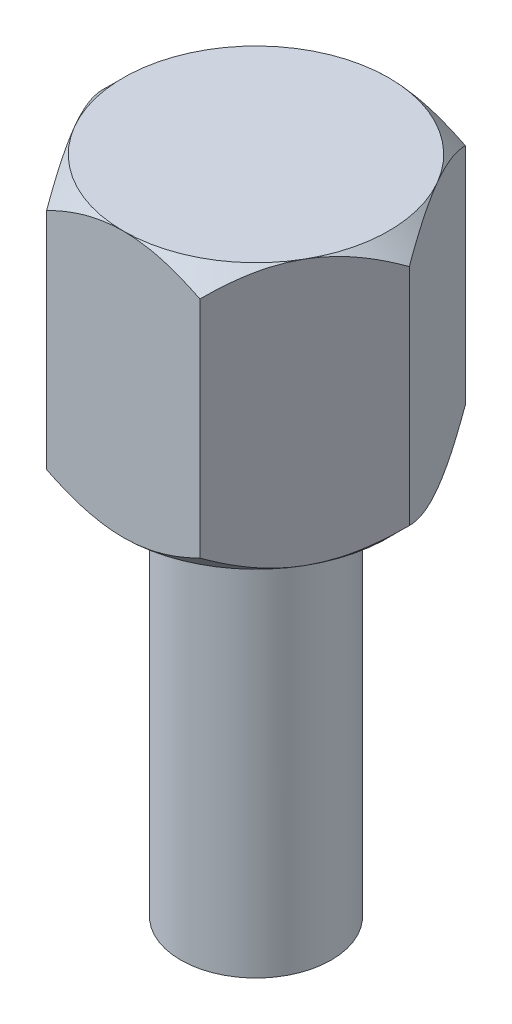
ISO-10303-21;
HEADER;
FILE_DESCRIPTION(('STEP AP214'),'2;1');
FILE_NAME('part.step','',(''),(''),'','','');
FILE_SCHEMA(('AUTOMOTIVE_DESIGN { 1 0 10303 214 1 1 1 1 }'));
ENDSEC;
DATA;
#1=APPLICATION_CONTEXT('core data for automotive mechanical design processes');
#2=APPLICATION_PROTOCOL_DEFINITION('international standard','automotive_design',2000,#1);
#3=PRODUCT_CONTEXT('',#1,'mechanical');
#4=PRODUCT('Part','Part','',(#3));
#5=PRODUCT_RELATED_PRODUCT_CATEGORY('part','',(#4));
#6=PRODUCT_DEFINITION_FORMATION('','',#4);
#7=PRODUCT_DEFINITION_CONTEXT('part definition',#1,'design');
#8=PRODUCT_DEFINITION('design','',#6,#7);
#9=PRODUCT_DEFINITION_SHAPE('','',#8);
#10=(LENGTH_UNIT() NAMED_UNIT(*) SI_UNIT(.MILLI.,.METRE.));
#11=(NAMED_UNIT(*) PLANE_ANGLE_UNIT() SI_UNIT($,.RADIAN.));
#12=(NAMED_UNIT(*) SI_UNIT($,.STERADIAN.) SOLID_ANGLE_UNIT());
#13=UNCERTAINTY_MEASURE_WITH_UNIT(LENGTH_MEASURE(1.E-05),#10,'distance_accuracy_value','');
#14=(GEOMETRIC_REPRESENTATION_CONTEXT(3) GLOBAL_UNCERTAINTY_ASSIGNED_CONTEXT((#13)) GLOBAL_UNIT_ASSIGNED_CONTEXT((#10,
#11,#12)) REPRESENTATION_CONTEXT('',''));
#15=CARTESIAN_POINT('',(0.,0.,0.));
#16=DIRECTION('',(0.,0.,1.));
#17=DIRECTION('',(1.,0.,0.));
#18=AXIS2_PLACEMENT_3D('',#15,#16,#17);
#19=CARTESIAN_POINT('',(0.,0.,0.));
#20=DIRECTION('',(0.,1.,0.));
#21=DIRECTION('',(0.,0.,1.));
#22=AXIS2_PLACEMENT_3D('',#19,#20,#21);
#23=PLANE('',#22);
#24=CARTESIAN_POINT('',(0.,0.,0.));
#25=DIRECTION('',(0.,-1.,0.));
#26=DIRECTION('',(0.,0.,-1.));
#27=AXIS2_PLACEMENT_3D('',#24,#25,#26);
#28=CIRCLE('',#27,2.3495);
#29=CARTESIAN_POINT('',(2.03472668619155,0.,1.17474999999999));
#30=VERTEX_POINT('',#29);
#31=CARTESIAN_POINT('',(0.,0.,2.3495));
#32=VERTEX_POINT('',#31);
#33=EDGE_CURVE('E54',#30,#32,#28,.T.);
#34=ORIENTED_EDGE('',*,*,#33,.T.);
#35=CARTESIAN_POINT('',(-2.03472668619153,0.,1.17475000000002));
#36=VERTEX_POINT('',#35);
#37=EDGE_CURVE('E162',#32,#36,#28,.T.);
#38=ORIENTED_EDGE('',*,*,#37,.T.);
#39=CARTESIAN_POINT('',(-2.03472668619155,0.,-1.17474999999999));
#40=VERTEX_POINT('',#39);
#41=EDGE_CURVE('E161',#36,#40,#28,.T.);
#42=ORIENTED_EDGE('',*,*,#41,.T.);
#43=CARTESIAN_POINT('',(0.,0.,-2.3495));
#44=VERTEX_POINT('',#43);
#45=EDGE_CURVE('E141',#40,#44,#28,.T.);
#46=ORIENTED_EDGE('',*,*,#45,.T.);
#47=CARTESIAN_POINT('',(2.03472668619154,0.,-1.17475));
#48=VERTEX_POINT('',#47);
#49=EDGE_CURVE('E127',#44,#48,#28,.T.);
#50=ORIENTED_EDGE('',*,*,#49,.T.);
#51=EDGE_CURVE('E139',#48,#30,#28,.T.);
#52=ORIENTED_EDGE('',*,*,#51,.T.);
#53=EDGE_LOOP('',(#34,#38,#42,#46,#50,#52));
#54=FACE_BOUND('',#53,.T.);
#55=CARTESIAN_POINT('',(0.,0.,0.));
#56=DIRECTION('',(0.,1.,0.));
#57=DIRECTION('',(0.,0.,1.));
#58=AXIS2_PLACEMENT_3D('',#55,#56,#57);
#59=CIRCLE('',#58,1.3335);
#60=CARTESIAN_POINT('',(0.,0.,1.3335));
#61=VERTEX_POINT('',#60);
#62=EDGE_CURVE('E260',#61,#61,#59,.F.);
#63=ORIENTED_EDGE('',*,*,#62,.F.);
#64=EDGE_LOOP('',(#63));
#65=FACE_BOUND('',#64,.T.);
#66=ADVANCED_FACE('F32',(#54,#65),#23,.F.);
#67=CARTESIAN_POINT('',(0.,-6.985,0.));
#68=DIRECTION('',(0.,1.,0.));
#69=DIRECTION('',(0.,0.,1.));
#70=AXIS2_PLACEMENT_3D('',#67,#68,#69);
#71=CYLINDRICAL_SURFACE('',#70,1.3335);
#72=CARTESIAN_POINT('',(0.,-6.985,0.));
#73=DIRECTION('',(0.,-1.,0.));
#74=DIRECTION('',(0.,0.,-1.));
#75=AXIS2_PLACEMENT_3D('',#72,#73,#74);
#76=CIRCLE('',#75,1.3335);
#77=CARTESIAN_POINT('',(0.,-6.985,-1.3335));
#78=VERTEX_POINT('',#77);
#79=EDGE_CURVE('E243',#78,#78,#76,.T.);
#80=ORIENTED_EDGE('',*,*,#79,.F.);
#81=EDGE_LOOP('',(#80));
#82=FACE_BOUND('',#81,.T.);
#83=ORIENTED_EDGE('',*,*,#62,.T.);
#84=EDGE_LOOP('',(#83));
#85=FACE_BOUND('',#84,.T.);
#86=ADVANCED_FACE('F329',(#82,#85),#71,.T.);
#87=CARTESIAN_POINT('',(0.,-6.985,0.));
#88=DIRECTION('',(0.,-1.,0.));
#89=DIRECTION('',(0.,0.,-1.));
#90=AXIS2_PLACEMENT_3D('',#87,#88,#89);
#91=PLANE('',#90);
#92=ORIENTED_EDGE('',*,*,#79,.T.);
#93=EDGE_LOOP('',(#92));
#94=FACE_BOUND('',#93,.T.);
#95=ADVANCED_FACE('F185',(#94),#91,.T.);
#96=CARTESIAN_POINT('',(0.,0.,0.));
#97=DIRECTION('',(0.,1.,0.));
#98=DIRECTION('',(0.,0.,-1.));
#99=AXIS2_PLACEMENT_3D('',#96,#97,#98);
#100=CONICAL_SURFACE('',#99,2.3495,0.785398163397454);
#101=CARTESIAN_POINT('',(-3.04117298107602,1.49353049048883,2.34950000000003));
#102=CARTESIAN_POINT('',(-2.96843710979389,1.43598372113909,2.34950000000003));
#103=CARTESIAN_POINT('',(-2.89533419226728,1.37889400059673,2.34950000000003));
#104=CARTESIAN_POINT('',(-2.74823611024862,1.26584392661056,2.34950000000003));
#105=CARTESIAN_POINT('',(-2.67424075723903,1.20988381870496,2.34950000000003));
#106=CARTESIAN_POINT('',(-2.5246639049502,1.09891259809597,2.34950000000003));
#107=CARTESIAN_POINT('',(-2.44907462077694,1.04391194624097,2.34950000000003));
#108=CARTESIAN_POINT('',(-2.29668393185426,0.935622716341921,2.34950000000002));
#109=CARTESIAN_POINT('',(-2.21988260853939,0.882334023998813,2.34950000000002));
#110=CARTESIAN_POINT('',(-2.05908468499275,0.773990004885351,2.34950000000002));
#111=CARTESIAN_POINT('',(-1.97497761402756,0.719097826399328,2.34950000000002));
#112=CARTESIAN_POINT('',(-1.80480721375091,0.612438994092082,2.34950000000002));
#113=CARTESIAN_POINT('',(-1.71874413441985,0.560671943932915,2.34950000000002));
#114=CARTESIAN_POINT('',(-1.54454932437983,0.46131443660129,2.34950000000002));
#115=CARTESIAN_POINT('',(-1.45642423725108,0.413712422552854,2.34950000000002));
#116=CARTESIAN_POINT('',(-1.27755397629254,0.323760502877434,2.34950000000001));
#117=CARTESIAN_POINT('',(-1.1868101412994,0.281407970103146,2.34950000000001));
#118=CARTESIAN_POINT('',(-1.01388974361576,0.208384854224984,2.34950000000001));
#119=CARTESIAN_POINT('',(-0.932053567282098,0.176916306059662,2.34950000000001));
#120=CARTESIAN_POINT('',(-0.766115107211668,0.12052020811029,2.34950000000001));
#121=CARTESIAN_POINT('',(-0.682012692918024,0.0955930360639293,2.34950000000001));
#122=CARTESIAN_POINT('',(-0.513626482235181,0.0541336604057618,2.34950000000001));
#123=CARTESIAN_POINT('',(-0.429384640542059,0.0374340801856685,2.3495));
#124=CARTESIAN_POINT('',(-0.259620658355294,0.0128110487239374,2.3495));
#125=CARTESIAN_POINT('',(-0.174098881033762,0.00488515413084087,2.3495));
#126=CARTESIAN_POINT('',(-0.00767828176418667,-0.0013731113032627,2.3495));
#127=CARTESIAN_POINT('',(0.0732005688500038,-0.000235910148391378,2.3495));
#128=CARTESIAN_POINT('',(0.234414464692311,0.0102939909473859,2.3495));
#129=CARTESIAN_POINT('',(0.314749466706155,0.0196873393407567,2.3495));
#130=CARTESIAN_POINT('',(0.47567005422075,0.0463269751997516,2.3495));
#131=CARTESIAN_POINT('',(0.556230839566116,0.0637205675106702,2.34949999999999));
#132=CARTESIAN_POINT('',(0.715528357239278,0.105335764403975,2.34949999999999));
#133=CARTESIAN_POINT('',(0.794265105157154,0.129557310604406,2.34949999999999));
#134=CARTESIAN_POINT('',(1.02917025065882,0.211275161319884,2.34949999999999));
#135=CARTESIAN_POINT('',(1.1823099340665,0.277493904848677,2.34949999999999));
#136=CARTESIAN_POINT('',(1.40646604553115,0.388031047774686,2.34949999999999));
#137=CARTESIAN_POINT('',(1.48039322912378,0.426828693011977,2.34949999999998));
#138=CARTESIAN_POINT('',(1.626579893997,0.507454806764778,2.34949999999998));
#139=CARTESIAN_POINT('',(1.69883965788431,0.549282756632444,2.34949999999998));
#140=CARTESIAN_POINT('',(1.83835620865343,0.633243189062903,2.34949999999998));
#141=CARTESIAN_POINT('',(1.90568400953498,0.675258982949647,2.34949999999998));
#142=CARTESIAN_POINT('',(2.03918405344241,0.761096347744087,2.34949999999998));
#143=CARTESIAN_POINT('',(2.10535621068251,0.804918051903759,2.34949999999998));
#144=CARTESIAN_POINT('',(2.23616822404651,0.893693638345672,2.34949999999998));
#145=CARTESIAN_POINT('',(2.30081606602508,0.938635802090038,2.34949999999998));
#146=CARTESIAN_POINT('',(2.42922252273128,1.02973744650038,2.34949999999998));
#147=CARTESIAN_POINT('',(2.49298137746709,1.07589658848211,2.34949999999997));
#148=CARTESIAN_POINT('',(2.55636695352802,1.12255447121584,2.34949999999997));
#149=B_SPLINE_CURVE_WITH_KNOTS('',3,(#101,#102,#103,#104,#105,#106,#107,#108,#109,#110,#111,
#112,#113,#114,#115,#116,#117,#118,#119,#120,#121,#122,#123,#124,#125,#126,#127,#128,#129,#130,
#131,#132,#133,#134,#135,#136,#137,#138,#139,#140,#141,#142,#143,#144,#145,#146,#147,#148),
.UNSPECIFIED.,.F.,.F.,(4,2,2,2,2,2,2,2,2,2,2,2,2,2,2,2,2,2,2,2,2,2,2,4),(0.,0.278247619308572,
0.55655508242495,0.836980191385023,1.11738653867579,1.41863753594848,1.71985024707439,
2.02019875302913,2.3203963348622,2.58320948376815,2.84603780571955,3.10327243639987,
3.36043541271735,3.60266318005777,3.84490997409741,4.09180762137511,4.33870315763532,
4.83770277404499,5.08814834599015,5.33855115405762,5.57660837997719,5.81468320289126,
6.05087209395873,6.28699593356355),.UNSPECIFIED.);
#150=CARTESIAN_POINT('',(1.35648445746105,0.36346891492205,2.34949999999999));
#151=VERTEX_POINT('',#150);
#152=EDGE_CURVE('E37',#32,#151,#149,.T.);
#153=ORIENTED_EDGE('',*,*,#152,.F.);
#154=ORIENTED_EDGE('',*,*,#33,.F.);
#155=CARTESIAN_POINT('',(1.35636898740722,0.363584392347572,2.34969999999999));
#156=CARTESIAN_POINT('',(1.40299898177264,0.316993248061652,2.26893448060242));
#157=CARTESIAN_POINT('',(1.45040870099858,0.273138389016638,2.18681843813052));
#158=CARTESIAN_POINT('',(1.54708239197061,0.19284104401896,2.01937469361175));
#159=CARTESIAN_POINT('',(1.59635555848423,0.156443237696364,1.93403106576035));
#160=CARTESIAN_POINT('',(1.6957125570454,0.0940930061436109,1.76193969616486));
#161=CARTESIAN_POINT('',(1.74577108317618,0.0679838590291379,1.67523578555434));
#162=CARTESIAN_POINT('',(1.84699020786412,0.0277572287308896,1.49991911889716));
#163=CARTESIAN_POINT('',(1.89814771396378,0.0136097156235198,1.41131171914404));
#164=CARTESIAN_POINT('',(1.98631428878822,0.000845044839261724,1.25860273201879));
#165=CARTESIAN_POINT('',(2.02320944335857,-0.00104461687236826,1.19469844974982));
#166=CARTESIAN_POINT('',(2.09693944919655,0.0021383549727543,1.06699433359609));
#167=CARTESIAN_POINT('',(2.13377427479078,0.00721342941053063,1.00319454417896));
#168=CARTESIAN_POINT('',(2.20709612615048,0.0240370707526633,0.876197372318939));
#169=CARTESIAN_POINT('',(2.24358271631778,0.035793103384641,0.813000744354225));
#170=CARTESIAN_POINT('',(2.31592495761877,0.0653333402077151,0.687700306887508));
#171=CARTESIAN_POINT('',(2.35178065689779,0.0831170822874305,0.625596413995325));
#172=CARTESIAN_POINT('',(2.44362384015089,0.135912845977569,0.466519354272096));
#173=CARTESIAN_POINT('',(2.49904181886124,0.174904781776592,0.370532599492996));
#174=CARTESIAN_POINT('',(2.58052905988125,0.240728626263341,0.22939255787774));
#175=CARTESIAN_POINT('',(2.60738273959343,0.263856114647469,0.182880620246053));
#176=CARTESIAN_POINT('',(2.66059266452019,0.312219356478471,0.0907183268059731));
#177=CARTESIAN_POINT('',(2.68694920313058,0.337453815493919,0.0450674628211294));
#178=CARTESIAN_POINT('',(2.71308438497589,0.363584392347571,-0.000200000000000081));
#179=B_SPLINE_CURVE_WITH_KNOTS('',3,(#155,#156,#157,#158,#159,#160,#161,#162,#163,#164,#165,
#166,#167,#168,#169,#170,#171,#172,#173,#174,#175,#176,#177,#178),.UNSPECIFIED.,.F.,.F.,(4,2,2,
2,2,2,2,2,2,2,2,4),(0.,0.312968052167394,0.627759717324112,0.937551547828646,1.24656331063831,
1.46769339391164,1.68890099485027,1.91035627466374,2.13179458055576,2.48354005356665,
2.65893589965825,2.83422477201639),.UNSPECIFIED.);
#180=EDGE_CURVE('E292',#151,#30,#179,.T.);
#181=ORIENTED_EDGE('',*,*,#180,.F.);
#182=EDGE_LOOP('',(#153,#154,#181));
#183=FACE_BOUND('',#182,.T.);
#184=ADVANCED_FACE('F180',(#183),#100,.T.);
#185=ORIENTED_EDGE('',*,*,#37,.F.);
#186=CARTESIAN_POINT('',(-1.35648445746101,0.36346891492205,2.34950000000001));
#187=VERTEX_POINT('',#186);
#188=EDGE_CURVE('E11',#187,#32,#149,.T.);
#189=ORIENTED_EDGE('',*,*,#188,.F.);
#190=CARTESIAN_POINT('',(-2.71308438497589,0.363584392347571,-0.000199999999981115));
#191=CARTESIAN_POINT('',(-2.66645439061047,0.31699324806165,0.0805655193975824));
#192=CARTESIAN_POINT('',(-2.61904467138453,0.273138389016636,0.162681561869483));
#193=CARTESIAN_POINT('',(-2.52237098041249,0.192841044018956,0.330125306388257));
#194=CARTESIAN_POINT('',(-2.47309781389887,0.156443237696359,0.415468934239654));
#195=CARTESIAN_POINT('',(-2.3737408153377,0.0940930061436044,0.587560303835141));
#196=CARTESIAN_POINT('',(-2.32368228920692,0.0679838590291303,0.674264214445668));
#197=CARTESIAN_POINT('',(-2.22246316451897,0.0277572287308811,0.849580881102846));
#198=CARTESIAN_POINT('',(-2.17130565841931,0.0136097156235113,0.938188280855967));
#199=CARTESIAN_POINT('',(-2.08313908359487,0.00084504483925225,1.09089726798122));
#200=CARTESIAN_POINT('',(-2.04624392902451,-0.00104461687237848,1.15480155025018));
#201=CARTESIAN_POINT('',(-1.97251392318653,0.00213835497274369,1.28250566640391));
#202=CARTESIAN_POINT('',(-1.93567909759231,0.00721342941052034,1.34630545582105));
#203=CARTESIAN_POINT('',(-1.8623572462326,0.024037070752653,1.47330262768106));
#204=CARTESIAN_POINT('',(-1.8258706560653,0.0357931033846304,1.53649925564578));
#205=CARTESIAN_POINT('',(-1.75352841476431,0.0653333402077039,1.66179969311249));
#206=CARTESIAN_POINT('',(-1.71767271548529,0.083117082287419,1.72390358600467));
#207=CARTESIAN_POINT('',(-1.62582953223218,0.135912845977558,1.88298064572791));
#208=CARTESIAN_POINT('',(-1.57041155352183,0.174904781776583,1.97896740050701));
#209=CARTESIAN_POINT('',(-1.48892431250182,0.240728626263335,2.12010744212227));
#210=CARTESIAN_POINT('',(-1.46207063278963,0.263856114647464,2.16661937975396));
#211=CARTESIAN_POINT('',(-1.40886070786287,0.312219356478469,2.25878167319404));
#212=CARTESIAN_POINT('',(-1.38250416925248,0.337453815493918,2.30443253717888));
#213=CARTESIAN_POINT('',(-1.35636898740717,0.363584392347571,2.34970000000001));
#214=B_SPLINE_CURVE_WITH_KNOTS('',3,(#190,#191,#192,#193,#194,#195,#196,#197,#198,#199,#200,
#201,#202,#203,#204,#205,#206,#207,#208,#209,#210,#211,#212,#213),.UNSPECIFIED.,.F.,.F.,(4,2,2,
2,2,2,2,2,2,2,2,4),(0.,0.312968052167397,0.627759717324119,0.937551547828656,1.24656331063832,
1.46769339391165,1.68890099485028,1.91035627466375,2.13179458055577,2.48354005356667,
2.65893589965828,2.83422477201643),.UNSPECIFIED.);
#215=EDGE_CURVE('E138',#36,#187,#214,.T.);
#216=ORIENTED_EDGE('',*,*,#215,.F.);
#217=EDGE_LOOP('',(#185,#189,#216));
#218=FACE_BOUND('',#217,.T.);
#219=ADVANCED_FACE('F184',(#218),#100,.T.);
#220=ORIENTED_EDGE('',*,*,#41,.F.);
#221=CARTESIAN_POINT('',(-2.71296891492205,0.36346891492205,0.));
#222=VERTEX_POINT('',#221);
#223=EDGE_CURVE('E171',#222,#36,#214,.T.);
#224=ORIENTED_EDGE('',*,*,#223,.F.);
#225=CARTESIAN_POINT('',(-1.3563689874072,0.363584392347571,-2.3497));
#226=CARTESIAN_POINT('',(-1.40299898177262,0.31699324806165,-2.26893448060243));
#227=CARTESIAN_POINT('',(-1.45040870099856,0.273138389016636,-2.18681843813053));
#228=CARTESIAN_POINT('',(-1.54708239197059,0.192841044018956,-2.01937469361176));
#229=CARTESIAN_POINT('',(-1.59635555848422,0.156443237696359,-1.93403106576036));
#230=CARTESIAN_POINT('',(-1.69571255704538,0.0940930061436045,-1.76193969616487));
#231=CARTESIAN_POINT('',(-1.74577108317616,0.0679838590291303,-1.67523578555434));
#232=CARTESIAN_POINT('',(-1.84699020786411,0.0277572287308808,-1.49991911889716));
#233=CARTESIAN_POINT('',(-1.89814771396377,0.0136097156235107,-1.41131171914404));
#234=CARTESIAN_POINT('',(-1.98631428878821,0.000845044839251927,-1.25860273201879));
#235=CARTESIAN_POINT('',(-2.02320944335856,-0.00104461687237853,-1.19469844974982));
#236=CARTESIAN_POINT('',(-2.09693944919654,0.00213835497274375,-1.06699433359609));
#237=CARTESIAN_POINT('',(-2.13377427479077,0.00721342941052024,-1.00319454417896));
#238=CARTESIAN_POINT('',(-2.20709612615047,0.0240370707526527,-0.876197372318941));
#239=CARTESIAN_POINT('',(-2.24358271631777,0.03579310338463,-0.813000744354227));
#240=CARTESIAN_POINT('',(-2.31592495761876,0.0653333402077036,-0.68770030688751));
#241=CARTESIAN_POINT('',(-2.35178065689778,0.0831170822874189,-0.625596413995328));
#242=CARTESIAN_POINT('',(-2.44362384015088,0.135912845977558,-0.466519354272095));
#243=CARTESIAN_POINT('',(-2.49904181886123,0.174904781776583,-0.370532599492992));
#244=CARTESIAN_POINT('',(-2.58052905988124,0.240728626263334,-0.22939255787773));
#245=CARTESIAN_POINT('',(-2.60738273959343,0.263856114647463,-0.182880620246042));
#246=CARTESIAN_POINT('',(-2.66059266452019,0.312219356478469,-0.0907183268059581));
#247=CARTESIAN_POINT('',(-2.68694920313058,0.337453815493918,-0.0450674628211127));
#248=CARTESIAN_POINT('',(-2.71308438497589,0.363584392347571,0.000200000000018921));
#249=B_SPLINE_CURVE_WITH_KNOTS('',3,(#225,#226,#227,#228,#229,#230,#231,#232,#233,#234,#235,
#236,#237,#238,#239,#240,#241,#242,#243,#244,#245,#246,#247,#248),.UNSPECIFIED.,.F.,.F.,(4,2,2,
2,2,2,2,2,2,2,2,4),(0.,0.312968052167397,0.627759717324118,0.937551547828656,1.24656331063832,
1.46769339391165,1.68890099485028,1.91035627466375,2.13179458055577,2.48354005356667,
2.65893589965828,2.83422477201643),.UNSPECIFIED.);
#250=EDGE_CURVE('E172',#40,#222,#249,.T.);
#251=ORIENTED_EDGE('',*,*,#250,.F.);
#252=EDGE_LOOP('',(#220,#224,#251));
#253=FACE_BOUND('',#252,.T.);
#254=ADVANCED_FACE('F356',(#253),#100,.T.);
#255=ORIENTED_EDGE('',*,*,#45,.F.);
#256=CARTESIAN_POINT('',(-1.35648445746104,0.363468914922049,-2.3495));
#257=VERTEX_POINT('',#256);
#258=EDGE_CURVE('E148',#257,#40,#249,.T.);
#259=ORIENTED_EDGE('',*,*,#258,.F.);
#260=CARTESIAN_POINT('',(-3.04117297977835,1.4935304894619,-2.34949999999999));
#261=CARTESIAN_POINT('',(-2.96843710853511,1.4359837201521,-2.34949999999999));
#262=CARTESIAN_POINT('',(-2.89533419104749,1.37889399964963,-2.34949999999999));
#263=CARTESIAN_POINT('',(-2.74823610910716,1.26584392574303,-2.34949999999999));
#264=CARTESIAN_POINT('',(-2.6742407561369,1.2098838178771,-2.34949999999999));
#265=CARTESIAN_POINT('',(-2.52466390392798,1.09891259734778,-2.34949999999999));
#266=CARTESIAN_POINT('',(-2.4490746197953,1.04391194553277,-2.34949999999999));
#267=CARTESIAN_POINT('',(-2.29668393095443,0.935622715713105,-2.34949999999999));
#268=CARTESIAN_POINT('',(-2.21988260768078,0.882334023409398,-2.34949999999999));
#269=CARTESIAN_POINT('',(-2.05908468422338,0.773990004378624,-2.34949999999999));
#270=CARTESIAN_POINT('',(-1.97497761330633,0.719097825935738,-2.34949999999999));
#271=CARTESIAN_POINT('',(-1.80480721312756,0.61243899371288,-2.34949999999999));
#272=CARTESIAN_POINT('',(-1.71874413384624,0.560671943594964,-2.34949999999999));
#273=CARTESIAN_POINT('',(-1.54454932390747,0.461314436342577,-2.3495));
#274=CARTESIAN_POINT('',(-1.45642423683023,0.41371242233215,-2.3495));
#275=CARTESIAN_POINT('',(-1.27755397597756,0.323760502728058,-2.3495));
#276=CARTESIAN_POINT('',(-1.18681014103878,0.281407969987096,-2.3495));
#277=CARTESIAN_POINT('',(-1.01388974337721,0.20838485412946,-2.3495));
#278=CARTESIAN_POINT('',(-0.932053567008559,0.176916305957588,-2.3495));
#279=CARTESIAN_POINT('',(-0.766115106866501,0.120520208002059,-2.3495));
#280=CARTESIAN_POINT('',(-0.682012692536223,0.0955930359560897,-2.3495));
#281=CARTESIAN_POINT('',(-0.513626481781114,0.054133660307469,-2.3495));
#282=CARTESIAN_POINT('',(-0.429384640052403,0.0374340800962504,-2.3495));
#283=CARTESIAN_POINT('',(-0.259620657795104,0.0128110486610371,-2.3495));
#284=CARTESIAN_POINT('',(-0.174098880438626,0.00488515408557804,-2.3495));
#285=CARTESIAN_POINT('',(-0.00767828111570004,-0.00137311130609052,-2.3495));
#286=CARTESIAN_POINT('',(0.0732005695169768,-0.00023591012814079,-2.3495));
#287=CARTESIAN_POINT('',(0.234414465393671,0.0102939910165244,-2.3495));
#288=CARTESIAN_POINT('',(0.314749467423415,0.0196873394357083,-2.3495));
#289=CARTESIAN_POINT('',(0.475670054969363,0.0463269753479688,-2.3495));
#290=CARTESIAN_POINT('',(0.556230840330106,0.0637205676865246,-2.3495));
#291=CARTESIAN_POINT('',(0.715528358032023,0.105335764634827,-2.3495));
#292=CARTESIAN_POINT('',(0.794265105963276,0.129557310862617,-2.3495));
#293=CARTESIAN_POINT('',(1.02917025163116,0.211275161703285,-2.3495));
#294=CARTESIAN_POINT('',(1.1823099351833,0.277493905346758,-2.3495));
#295=CARTESIAN_POINT('',(1.40646604685585,0.388031048454254,-2.34950000000001));
#296=CARTESIAN_POINT('',(1.48039323051656,0.426828693753819,-2.34950000000001));
#297=CARTESIAN_POINT('',(1.62657989552374,0.507454807633201,-2.34950000000001));
#298=CARTESIAN_POINT('',(1.69883965947693,0.549282757565174,-2.34950000000001));
#299=CARTESIAN_POINT('',(1.83835621036527,0.633243190117535,-2.34950000000001));
#300=CARTESIAN_POINT('',(1.9056840113004,0.67525898406157,-2.34950000000001));
#301=CARTESIAN_POINT('',(2.0391840553142,0.761096348970832,-2.34950000000001));
#302=CARTESIAN_POINT('',(2.10535621260711,0.804918053188037,-2.34950000000001));
#303=CARTESIAN_POINT('',(2.23616822607542,0.893693639744354,-2.34950000000001));
#304=CARTESIAN_POINT('',(2.30081606810551,0.938635803545587,-2.34950000000001));
#305=CARTESIAN_POINT('',(2.42922252491441,1.02973744806958,-2.34950000000001));
#306=CARTESIAN_POINT('',(2.4929813797014,1.07589659010809,-2.34950000000001));
#307=CARTESIAN_POINT('',(2.55636695581342,1.12255447289854,-2.34950000000001));
#308=B_SPLINE_CURVE_WITH_KNOTS('',3,(#260,#261,#262,#263,#264,#265,#266,#267,#268,#269,#270,
#271,#272,#273,#274,#275,#276,#277,#278,#279,#280,#281,#282,#283,#284,#285,#286,#287,#288,#289,
#290,#291,#292,#293,#294,#295,#296,#297,#298,#299,#300,#301,#302,#303,#304,#305,#306,#307),
.UNSPECIFIED.,.F.,.F.,(4,2,2,2,2,2,2,2,2,2,2,2,2,2,2,2,2,2,2,2,2,2,2,4),(0.,0.278247619142713,
0.556555082093182,0.83698019088424,1.11738653800602,1.41863753508707,1.7198502460214,
2.02019875178612,2.32039633342951,2.58320948244012,2.84603780449601,3.10327243527521,
3.36043541169147,3.60266317908804,3.84490997318394,4.09180762052424,4.33870315684702,
4.83770277378851,5.08814834600141,5.33855115433651,5.57660838048345,5.81468320362489,
6.05087209491666,6.28699593474576),.UNSPECIFIED.);
#309=EDGE_CURVE('E144',#44,#257,#308,.F.);
#310=ORIENTED_EDGE('',*,*,#309,.F.);
#311=EDGE_LOOP('',(#255,#259,#310));
#312=FACE_BOUND('',#311,.T.);
#313=ADVANCED_FACE('F145',(#312),#100,.T.);
#314=ORIENTED_EDGE('',*,*,#49,.F.);
#315=CARTESIAN_POINT('',(1.35648445746102,0.36346891492205,-2.3495));
#316=VERTEX_POINT('',#315);
#317=EDGE_CURVE('E131',#316,#44,#308,.F.);
#318=ORIENTED_EDGE('',*,*,#317,.F.);
#319=CARTESIAN_POINT('',(2.71308438497589,0.363584392347571,0.000200000000000061));
#320=CARTESIAN_POINT('',(2.66645439061047,0.31699324806165,-0.0805655193975637));
#321=CARTESIAN_POINT('',(2.61904467138453,0.273138389016636,-0.162681561869465));
#322=CARTESIAN_POINT('',(2.5223709804125,0.192841044018956,-0.330125306388239));
#323=CARTESIAN_POINT('',(2.47309781389887,0.156443237696359,-0.415468934239637));
#324=CARTESIAN_POINT('',(2.37374081533771,0.0940930061436043,-0.587560303835125));
#325=CARTESIAN_POINT('',(2.32368228920692,0.0679838590291303,-0.674264214445652));
#326=CARTESIAN_POINT('',(2.22246316451897,0.0277572287308808,-0.849580881102831));
#327=CARTESIAN_POINT('',(2.17130565841932,0.0136097156235107,-0.938188280855952));
#328=CARTESIAN_POINT('',(2.08313908359488,0.000845044839252352,-1.09089726798121));
#329=CARTESIAN_POINT('',(2.04624392902452,-0.0010446168723777,-1.15480155025017));
#330=CARTESIAN_POINT('',(1.97251392318654,0.00213835497274465,-1.2825056664039));
#331=CARTESIAN_POINT('',(1.93567909759232,0.00721342941052081,-1.34630545582104));
#332=CARTESIAN_POINT('',(1.86235724623261,0.0240370707526532,-1.47330262768105));
#333=CARTESIAN_POINT('',(1.82587065606531,0.0357931033846308,-1.53649925564576));
#334=CARTESIAN_POINT('',(1.75352841476432,0.0653333402077046,-1.66179969311248));
#335=CARTESIAN_POINT('',(1.7176727154853,0.0831170822874197,-1.72390358600466));
#336=CARTESIAN_POINT('',(1.6258295322322,0.135912845977558,-1.88298064572789));
#337=CARTESIAN_POINT('',(1.57041155352184,0.174904781776583,-1.978967400507));
#338=CARTESIAN_POINT('',(1.48892431250184,0.240728626263335,-2.12010744212226));
#339=CARTESIAN_POINT('',(1.46207063278965,0.263856114647464,-2.16661937975395));
#340=CARTESIAN_POINT('',(1.40886070786288,0.312219356478469,-2.25878167319403));
#341=CARTESIAN_POINT('',(1.3825041692525,0.337453815493918,-2.30443253717887));
#342=CARTESIAN_POINT('',(1.35636898740718,0.363584392347571,-2.3497));
#343=B_SPLINE_CURVE_WITH_KNOTS('',3,(#319,#320,#321,#322,#323,#324,#325,#326,#327,#328,#329,
#330,#331,#332,#333,#334,#335,#336,#337,#338,#339,#340,#341,#342),.UNSPECIFIED.,.F.,.F.,(4,2,2,
2,2,2,2,2,2,2,2,4),(0.,0.312968052167397,0.627759717324119,0.937551547828657,1.24656331063832,
1.46769339391165,1.68890099485028,1.91035627466375,2.13179458055577,2.48354005356667,
2.65893589965828,2.83422477201642),.UNSPECIFIED.);
#344=EDGE_CURVE('E133',#48,#316,#343,.T.);
#345=ORIENTED_EDGE('',*,*,#344,.F.);
#346=EDGE_LOOP('',(#314,#318,#345));
#347=FACE_BOUND('',#346,.T.);
#348=ADVANCED_FACE('F129',(#347),#100,.T.);
#349=ORIENTED_EDGE('',*,*,#51,.F.);
#350=CARTESIAN_POINT('',(2.71296891492205,0.36346891492205,0.));
#351=VERTEX_POINT('',#350);
#352=EDGE_CURVE('E206',#351,#48,#343,.T.);
#353=ORIENTED_EDGE('',*,*,#352,.F.);
#354=EDGE_CURVE('E207',#30,#351,#179,.T.);
#355=ORIENTED_EDGE('',*,*,#354,.F.);
#356=EDGE_LOOP('',(#349,#353,#355));
#357=FACE_BOUND('',#356,.T.);
#358=ADVANCED_FACE('F186',(#357),#100,.T.);
#359=CARTESIAN_POINT('',(0.,4.699,0.));
#360=DIRECTION('',(0.,1.,0.));
#361=DIRECTION('',(0.,0.,1.));
#362=AXIS2_PLACEMENT_3D('',#359,#360,#361);
#363=PLANE('',#362);
#364=CARTESIAN_POINT('',(0.,4.699,0.));
#365=DIRECTION('',(0.,1.,0.));
#366=DIRECTION('',(0.,0.,1.));
#367=AXIS2_PLACEMENT_3D('',#364,#365,#366);
#368=CIRCLE('',#367,2.3495);
#369=CARTESIAN_POINT('',(0.,4.699,2.3495));
#370=VERTEX_POINT('',#369);
#371=CARTESIAN_POINT('',(-2.03472668619153,4.699,1.17475000000002));
#372=VERTEX_POINT('',#371);
#373=EDGE_CURVE('E265',#370,#372,#368,.F.);
#374=ORIENTED_EDGE('',*,*,#373,.F.);
#375=CARTESIAN_POINT('',(2.03472668619155,4.699,1.17474999999999));
#376=VERTEX_POINT('',#375);
#377=EDGE_CURVE('E262',#376,#370,#368,.F.);
#378=ORIENTED_EDGE('',*,*,#377,.F.);
#379=CARTESIAN_POINT('',(2.03472668619154,4.699,-1.17475));
#380=VERTEX_POINT('',#379);
#381=EDGE_CURVE('E264',#380,#376,#368,.F.);
#382=ORIENTED_EDGE('',*,*,#381,.F.);
#383=CARTESIAN_POINT('',(0.,4.699,0.));
#384=DIRECTION('',(0.,-1.,0.));
#385=DIRECTION('',(0.,0.,-1.));
#386=AXIS2_PLACEMENT_3D('',#383,#384,#385);
#387=CIRCLE('',#386,2.3495);
#388=CARTESIAN_POINT('',(0.,4.699,-2.3495));
#389=VERTEX_POINT('',#388);
#390=EDGE_CURVE('E287',#389,#380,#387,.T.);
#391=ORIENTED_EDGE('',*,*,#390,.F.);
#392=CARTESIAN_POINT('',(-2.03472668619155,4.699,-1.17474999999999));
#393=VERTEX_POINT('',#392);
#394=EDGE_CURVE('E270',#393,#389,#368,.F.);
#395=ORIENTED_EDGE('',*,*,#394,.F.);
#396=EDGE_CURVE('E272',#372,#393,#368,.F.);
#397=ORIENTED_EDGE('',*,*,#396,.F.);
#398=EDGE_LOOP('',(#374,#378,#382,#391,#395,#397));
#399=FACE_BOUND('',#398,.T.);
#400=ADVANCED_FACE('F288',(#399),#363,.T.);
#401=CARTESIAN_POINT('',(0.,4.699,0.));
#402=DIRECTION('',(0.,-1.,0.));
#403=DIRECTION('',(0.,0.,-1.));
#404=AXIS2_PLACEMENT_3D('',#401,#402,#403);
#405=CONICAL_SURFACE('',#404,2.3495,0.785398163397454);
#406=ORIENTED_EDGE('',*,*,#381,.T.);
#407=CARTESIAN_POINT('',(2.71308438497589,4.33541560765243,-0.0002));
#408=CARTESIAN_POINT('',(2.66645439061047,4.38200675193835,0.0805655193975635));
#409=CARTESIAN_POINT('',(2.61904467138453,4.42586161098336,0.162681561869464));
#410=CARTESIAN_POINT('',(2.5223709804125,4.50615895598104,0.330125306388237));
#411=CARTESIAN_POINT('',(2.47309781389888,4.54255676230364,0.415468934239634));
#412=CARTESIAN_POINT('',(2.37374081533771,4.60490699385639,0.587560303835121));
#413=CARTESIAN_POINT('',(2.32368228920693,4.63101614097086,0.674264214445648));
#414=CARTESIAN_POINT('',(2.22246316451898,4.67124277126911,0.849580881102826));
#415=CARTESIAN_POINT('',(2.17130565841933,4.68539028437648,0.938188280855947));
#416=CARTESIAN_POINT('',(2.08313908359489,4.69815495516074,1.0908972679812));
#417=CARTESIAN_POINT('',(2.04624392902453,4.70004461687237,1.15480155025016));
#418=CARTESIAN_POINT('',(1.97251392318656,4.69686164502725,1.28250566640389));
#419=CARTESIAN_POINT('',(1.93567909759233,4.69178657058947,1.34630545582103));
#420=CARTESIAN_POINT('',(1.86235724623263,4.67496292924734,1.47330262768105));
#421=CARTESIAN_POINT('',(1.82587065606533,4.66320689661536,1.53649925564576));
#422=CARTESIAN_POINT('',(1.75352841476434,4.63366665979228,1.66179969311248));
#423=CARTESIAN_POINT('',(1.71767271548531,4.61588291771257,1.72390358600466));
#424=CARTESIAN_POINT('',(1.62582953223222,4.56308715402243,1.88298064572789));
#425=CARTESIAN_POINT('',(1.57041155352187,4.52409521822341,1.97896740050699));
#426=CARTESIAN_POINT('',(1.48892431250186,4.45827137373666,2.12010744212225));
#427=CARTESIAN_POINT('',(1.46207063278968,4.43514388535253,2.16661937975393));
#428=CARTESIAN_POINT('',(1.40886070786291,4.38678064352153,2.25878167319401));
#429=CARTESIAN_POINT('',(1.38250416925253,4.36154618450608,2.30443253717886));
#430=CARTESIAN_POINT('',(1.35636898740722,4.33541560765243,2.34969999999999));
#431=B_SPLINE_CURVE_WITH_KNOTS('',3,(#407,#408,#409,#410,#411,#412,#413,#414,#415,#416,#417,
#418,#419,#420,#421,#422,#423,#424,#425,#426,#427,#428,#429,#430),.UNSPECIFIED.,.F.,.F.,(4,2,2,
2,2,2,2,2,2,2,2,4),(0.,0.312968052167394,0.627759717324111,0.937551547828646,1.2465633106383,
1.46769339391163,1.68890099485027,1.91035627466374,2.13179458055576,2.48354005356664,
2.65893589965824,2.83422477201639),.UNSPECIFIED.);
#432=CARTESIAN_POINT('',(2.71296891492205,4.33553108507795,0.));
#433=VERTEX_POINT('',#432);
#434=EDGE_CURVE('E299',#433,#376,#431,.T.);
#435=ORIENTED_EDGE('',*,*,#434,.F.);
#436=CARTESIAN_POINT('',(1.35636898740718,4.33541560765243,-2.3497));
#437=CARTESIAN_POINT('',(1.40299898177261,4.38200675193835,-2.26893448060244));
#438=CARTESIAN_POINT('',(1.45040870099855,4.42586161098336,-2.18681843813054));
#439=CARTESIAN_POINT('',(1.54708239197058,4.50615895598104,-2.01937469361177));
#440=CARTESIAN_POINT('',(1.5963555584842,4.54255676230364,-1.93403106576037));
#441=CARTESIAN_POINT('',(1.69571255704537,4.6049069938564,-1.76193969616488));
#442=CARTESIAN_POINT('',(1.74577108317615,4.63101614097087,-1.67523578555435));
#443=CARTESIAN_POINT('',(1.8469902078641,4.67124277126912,-1.49991911889717));
#444=CARTESIAN_POINT('',(1.89814771396376,4.68539028437649,-1.41131171914405));
#445=CARTESIAN_POINT('',(1.9863142887882,4.69815495516075,-1.2586027320188));
#446=CARTESIAN_POINT('',(2.02320944335856,4.70004461687238,-1.19469844974984));
#447=CARTESIAN_POINT('',(2.09693944919653,4.69686164502726,-1.06699433359611));
#448=CARTESIAN_POINT('',(2.13377427479076,4.69178657058948,-1.00319454417897));
#449=CARTESIAN_POINT('',(2.20709612615046,4.67496292924735,-0.876197372318956));
#450=CARTESIAN_POINT('',(2.24358271631776,4.66320689661537,-0.813000744354242));
#451=CARTESIAN_POINT('',(2.31592495761875,4.6336666597923,-0.687700306887525));
#452=CARTESIAN_POINT('',(2.35178065689778,4.61588291771258,-0.625596413995343));
#453=CARTESIAN_POINT('',(2.44362384015088,4.56308715402244,-0.466519354272111));
#454=CARTESIAN_POINT('',(2.49904181886123,4.52409521822342,-0.370532599493009));
#455=CARTESIAN_POINT('',(2.58052905988124,4.45827137373667,-0.229392557877747));
#456=CARTESIAN_POINT('',(2.60738273959343,4.43514388535254,-0.182880620246059));
#457=CARTESIAN_POINT('',(2.66059266452019,4.38678064352153,-0.0907183268059759));
#458=CARTESIAN_POINT('',(2.68694920313058,4.36154618450608,-0.0450674628211308));
#459=CARTESIAN_POINT('',(2.71308438497589,4.33541560765243,0.000200000000000203));
#460=B_SPLINE_CURVE_WITH_KNOTS('',3,(#436,#437,#438,#439,#440,#441,#442,#443,#444,#445,#446,
#447,#448,#449,#450,#451,#452,#453,#454,#455,#456,#457,#458,#459),.UNSPECIFIED.,.F.,.F.,(4,2,2,
2,2,2,2,2,2,2,2,4),(0.,0.312968052167397,0.627759717324119,0.937551547828656,1.24656331063832,
1.46769339391165,1.68890099485028,1.91035627466375,2.13179458055577,2.48354005356667,
2.65893589965828,2.83422477201643),.UNSPECIFIED.);
#461=EDGE_CURVE('E220',#380,#433,#460,.T.);
#462=ORIENTED_EDGE('',*,*,#461,.F.);
#463=EDGE_LOOP('',(#406,#435,#462));
#464=FACE_BOUND('',#463,.T.);
#465=ADVANCED_FACE('F332',(#464),#405,.T.);
#466=ORIENTED_EDGE('',*,*,#390,.T.);
#467=CARTESIAN_POINT('',(1.35648445746102,4.33553108507795,-2.3495));
#468=VERTEX_POINT('',#467);
#469=EDGE_CURVE('E228',#468,#380,#460,.T.);
#470=ORIENTED_EDGE('',*,*,#469,.F.);
#471=CARTESIAN_POINT('',(-3.04117297977835,3.2054695105381,-2.34949999999999));
#472=CARTESIAN_POINT('',(-2.96843710853511,3.26301627984789,-2.34949999999999));
#473=CARTESIAN_POINT('',(-2.89533419104749,3.32010600035037,-2.34949999999999));
#474=CARTESIAN_POINT('',(-2.74823610910716,3.43315607425697,-2.34949999999999));
#475=CARTESIAN_POINT('',(-2.6742407561369,3.4891161821229,-2.34949999999999));
#476=CARTESIAN_POINT('',(-2.52466390392798,3.60008740265222,-2.34949999999999));
#477=CARTESIAN_POINT('',(-2.4490746197953,3.65508805446723,-2.34949999999999));
#478=CARTESIAN_POINT('',(-2.29668393095443,3.76337728428689,-2.34949999999999));
#479=CARTESIAN_POINT('',(-2.21988260768078,3.8166659765906,-2.34949999999999));
#480=CARTESIAN_POINT('',(-2.05908468422338,3.92500999562138,-2.34949999999999));
#481=CARTESIAN_POINT('',(-1.97497761330633,3.97990217406426,-2.34949999999999));
#482=CARTESIAN_POINT('',(-1.80480721312756,4.08656100628712,-2.34949999999999));
#483=CARTESIAN_POINT('',(-1.71874413384624,4.13832805640504,-2.34949999999999));
#484=CARTESIAN_POINT('',(-1.54454932390747,4.23768556365742,-2.3495));
#485=CARTESIAN_POINT('',(-1.45642423683023,4.28528757766785,-2.3495));
#486=CARTESIAN_POINT('',(-1.27755397597755,4.37523949727194,-2.3495));
#487=CARTESIAN_POINT('',(-1.18681014103878,4.4175920300129,-2.3495));
#488=CARTESIAN_POINT('',(-1.01388974337721,4.49061514587054,-2.3495));
#489=CARTESIAN_POINT('',(-0.932053567008559,4.52208369404241,-2.3495));
#490=CARTESIAN_POINT('',(-0.766115106866501,4.57847979199794,-2.3495));
#491=CARTESIAN_POINT('',(-0.682012692536224,4.60340696404391,-2.3495));
#492=CARTESIAN_POINT('',(-0.513626481781114,4.64486633969253,-2.3495));
#493=CARTESIAN_POINT('',(-0.429384640052404,4.66156591990375,-2.3495));
#494=CARTESIAN_POINT('',(-0.259620657795105,4.68618895133896,-2.3495));
#495=CARTESIAN_POINT('',(-0.174098880438628,4.69411484591442,-2.3495));
#496=CARTESIAN_POINT('',(-0.00767828111570164,4.70037311130609,-2.3495));
#497=CARTESIAN_POINT('',(0.073200569516975,4.69923591012814,-2.3495));
#498=CARTESIAN_POINT('',(0.234414465393669,4.68870600898348,-2.3495));
#499=CARTESIAN_POINT('',(0.314749467423413,4.67931266056429,-2.3495));
#500=CARTESIAN_POINT('',(0.475670054969361,4.65267302465203,-2.3495));
#501=CARTESIAN_POINT('',(0.556230840330104,4.63527943231348,-2.3495));
#502=CARTESIAN_POINT('',(0.715528358032021,4.59366423536517,-2.3495));
#503=CARTESIAN_POINT('',(0.794265105963274,4.56944268913738,-2.3495));
#504=CARTESIAN_POINT('',(1.02917025163116,4.48772483829672,-2.3495));
#505=CARTESIAN_POINT('',(1.18230993518329,4.42150609465324,-2.3495));
#506=CARTESIAN_POINT('',(1.40646604685585,4.31096895154575,-2.34950000000001));
#507=CARTESIAN_POINT('',(1.48039323051656,4.27217130624618,-2.34950000000001));
#508=CARTESIAN_POINT('',(1.62657989552374,4.1915451923668,-2.34950000000001));
#509=CARTESIAN_POINT('',(1.69883965947693,4.14971724243483,-2.34950000000001));
#510=CARTESIAN_POINT('',(1.83835621036527,4.06575680988247,-2.34950000000001));
#511=CARTESIAN_POINT('',(1.90568401130039,4.02374101593843,-2.34950000000001));
#512=CARTESIAN_POINT('',(2.0391840553142,3.93790365102917,-2.34950000000001));
#513=CARTESIAN_POINT('',(2.10535621260711,3.89408194681197,-2.34950000000001));
#514=CARTESIAN_POINT('',(2.23616822607542,3.80530636025565,-2.34950000000001));
#515=CARTESIAN_POINT('',(2.30081606810551,3.76036419645442,-2.34950000000001));
#516=CARTESIAN_POINT('',(2.42922252491441,3.66926255193043,-2.34950000000001));
#517=CARTESIAN_POINT('',(2.4929813797014,3.62310340989191,-2.34950000000001));
#518=CARTESIAN_POINT('',(2.55636695581342,3.57644552710147,-2.34950000000001));
#519=B_SPLINE_CURVE_WITH_KNOTS('',3,(#471,#472,#473,#474,#475,#476,#477,#478,#479,#480,#481,
#482,#483,#484,#485,#486,#487,#488,#489,#490,#491,#492,#493,#494,#495,#496,#497,#498,#499,#500,
#501,#502,#503,#504,#505,#506,#507,#508,#509,#510,#511,#512,#513,#514,#515,#516,#517,#518),
.UNSPECIFIED.,.F.,.F.,(4,2,2,2,2,2,2,2,2,2,2,2,2,2,2,2,2,2,2,2,2,2,2,4),(0.,0.278247619142713,
0.556555082093183,0.836980190884241,1.11738653800602,1.41863753508708,1.7198502460214,
2.02019875178612,2.32039633342951,2.58320948244013,2.84603780449601,3.10327243527521,
3.36043541169147,3.60266317908804,3.84490997318394,4.09180762052424,4.33870315684702,
4.83770277378851,5.08814834600141,5.33855115433651,5.57660838048345,5.81468320362489,
6.05087209491666,6.28699593474576),.UNSPECIFIED.);
#520=EDGE_CURVE('E235',#389,#468,#519,.T.);
#521=ORIENTED_EDGE('',*,*,#520,.F.);
#522=EDGE_LOOP('',(#466,#470,#521));
#523=FACE_BOUND('',#522,.T.);
#524=ADVANCED_FACE('F391',(#523),#405,.T.);
#525=CARTESIAN_POINT('',(-2.71308438497589,4.33541560765243,0.000200000000018945));
#526=CARTESIAN_POINT('',(-2.66645439061047,4.38200675193835,-0.0805655193975456));
#527=CARTESIAN_POINT('',(-2.61904467138453,4.42586161098336,-0.162681561869447));
#528=CARTESIAN_POINT('',(-2.5223709804125,4.50615895598104,-0.330125306388222));
#529=CARTESIAN_POINT('',(-2.47309781389887,4.54255676230364,-0.41546893423962));
#530=CARTESIAN_POINT('',(-2.37374081533771,4.6049069938564,-0.587560303835108));
#531=CARTESIAN_POINT('',(-2.32368228920693,4.63101614097087,-0.674264214445636));
#532=CARTESIAN_POINT('',(-2.22246316451898,4.67124277126912,-0.849580881102815));
#533=CARTESIAN_POINT('',(-2.17130565841932,4.68539028437649,-0.938188280855937));
#534=CARTESIAN_POINT('',(-2.08313908359488,4.69815495516075,-1.09089726798119));
#535=CARTESIAN_POINT('',(-2.04624392902453,4.70004461687238,-1.15480155025016));
#536=CARTESIAN_POINT('',(-1.97251392318655,4.69686164502726,-1.28250566640388));
#537=CARTESIAN_POINT('',(-1.93567909759232,4.69178657058948,-1.34630545582102));
#538=CARTESIAN_POINT('',(-1.86235724623262,4.67496292924735,-1.47330262768104));
#539=CARTESIAN_POINT('',(-1.82587065606532,4.66320689661537,-1.53649925564575));
#540=CARTESIAN_POINT('',(-1.75352841476433,4.6336666597923,-1.66179969311247));
#541=CARTESIAN_POINT('',(-1.71767271548531,4.61588291771258,-1.72390358600465));
#542=CARTESIAN_POINT('',(-1.62582953223221,4.56308715402244,-1.88298064572788));
#543=CARTESIAN_POINT('',(-1.57041155352186,4.52409521822342,-1.97896740050699));
#544=CARTESIAN_POINT('',(-1.48892431250185,4.45827137373667,-2.12010744212225));
#545=CARTESIAN_POINT('',(-1.46207063278966,4.43514388535254,-2.16661937975394));
#546=CARTESIAN_POINT('',(-1.4088607078629,4.38678064352153,-2.25878167319402));
#547=CARTESIAN_POINT('',(-1.38250416925251,4.36154618450608,-2.30443253717886));
#548=CARTESIAN_POINT('',(-1.3563689874072,4.33541560765243,-2.3497));
#549=B_SPLINE_CURVE_WITH_KNOTS('',3,(#525,#526,#527,#528,#529,#530,#531,#532,#533,#534,#535,
#536,#537,#538,#539,#540,#541,#542,#543,#544,#545,#546,#547,#548),.UNSPECIFIED.,.F.,.F.,(4,2,2,
2,2,2,2,2,2,2,2,4),(0.,0.312968052167397,0.627759717324118,0.937551547828656,1.24656331063832,
1.46769339391165,1.68890099485028,1.91035627466375,2.13179458055577,2.48354005356667,
2.65893589965828,2.83422477201643),.UNSPECIFIED.);
#550=CARTESIAN_POINT('',(-1.35648445746104,4.33553108507795,-2.3495));
#551=VERTEX_POINT('',#550);
#552=EDGE_CURVE('E242',#393,#551,#549,.T.);
#553=ORIENTED_EDGE('',*,*,#552,.F.);
#554=ORIENTED_EDGE('',*,*,#394,.T.);
#555=EDGE_CURVE('E241',#551,#389,#519,.T.);
#556=ORIENTED_EDGE('',*,*,#555,.F.);
#557=EDGE_LOOP('',(#553,#554,#556));
#558=FACE_BOUND('',#557,.T.);
#559=ADVANCED_FACE('F187',(#558),#405,.T.);
#560=CARTESIAN_POINT('',(-1.35636898740717,4.33541560765243,2.34970000000001));
#561=CARTESIAN_POINT('',(-1.40299898177259,4.38200675193835,2.26893448060245));
#562=CARTESIAN_POINT('',(-1.45040870099853,4.42586161098336,2.18681843813055));
#563=CARTESIAN_POINT('',(-1.54708239197057,4.50615895598104,2.01937469361178));
#564=CARTESIAN_POINT('',(-1.59635555848419,4.54255676230364,1.93403106576038));
#565=CARTESIAN_POINT('',(-1.69571255704536,4.6049069938564,1.76193969616489));
#566=CARTESIAN_POINT('',(-1.74577108317614,4.63101614097087,1.67523578555436));
#567=CARTESIAN_POINT('',(-1.84699020786409,4.67124277126912,1.49991911889719));
#568=CARTESIAN_POINT('',(-1.89814771396375,4.68539028437649,1.41131171914407));
#569=CARTESIAN_POINT('',(-1.98631428878819,4.69815495516075,1.25860273201881));
#570=CARTESIAN_POINT('',(-2.02320944335855,4.70004461687238,1.19469844974985));
#571=CARTESIAN_POINT('',(-2.09693944919653,4.69686164502726,1.06699433359612));
#572=CARTESIAN_POINT('',(-2.13377427479075,4.69178657058948,1.00319454417898));
#573=CARTESIAN_POINT('',(-2.20709612615045,4.67496292924735,0.876197372318969));
#574=CARTESIAN_POINT('',(-2.24358271631776,4.66320689661537,0.813000744354256));
#575=CARTESIAN_POINT('',(-2.31592495761875,4.6336666597923,0.68770030688754));
#576=CARTESIAN_POINT('',(-2.35178065689777,4.61588291771258,0.625596413995358));
#577=CARTESIAN_POINT('',(-2.44362384015088,4.56308715402244,0.466519354272127));
#578=CARTESIAN_POINT('',(-2.49904181886123,4.52409521822342,0.370532599493025));
#579=CARTESIAN_POINT('',(-2.58052905988124,4.45827137373667,0.229392557877765));
#580=CARTESIAN_POINT('',(-2.60738273959342,4.43514388535254,0.182880620246077));
#581=CARTESIAN_POINT('',(-2.66059266452019,4.38678064352153,0.0907183268059945));
#582=CARTESIAN_POINT('',(-2.68694920313058,4.36154618450608,0.0450674628211497));
#583=CARTESIAN_POINT('',(-2.71308438497589,4.33541560765243,-0.000199999999981191));
#584=B_SPLINE_CURVE_WITH_KNOTS('',3,(#560,#561,#562,#563,#564,#565,#566,#567,#568,#569,#570,
#571,#572,#573,#574,#575,#576,#577,#578,#579,#580,#581,#582,#583),.UNSPECIFIED.,.F.,.F.,(4,2,2,
2,2,2,2,2,2,2,2,4),(0.,0.312968052167398,0.627759717324119,0.937551547828657,1.24656331063832,
1.46769339391165,1.68890099485029,1.91035627466375,2.13179458055577,2.48354005356667,
2.65893589965828,2.83422477201643),.UNSPECIFIED.);
#585=CARTESIAN_POINT('',(-2.71296891492205,4.33553108507795,0.));
#586=VERTEX_POINT('',#585);
#587=EDGE_CURVE('E297',#372,#586,#584,.T.);
#588=ORIENTED_EDGE('',*,*,#587,.F.);
#589=ORIENTED_EDGE('',*,*,#396,.T.);
#590=EDGE_CURVE('E229',#586,#393,#549,.T.);
#591=ORIENTED_EDGE('',*,*,#590,.F.);
#592=EDGE_LOOP('',(#588,#589,#591));
#593=FACE_BOUND('',#592,.T.);
#594=ADVANCED_FACE('F393',(#593),#405,.T.);
#595=CARTESIAN_POINT('',(-3.04117298107602,3.20546950951117,2.34950000000003));
#596=CARTESIAN_POINT('',(-2.96843710979389,3.26301627886091,2.34950000000003));
#597=CARTESIAN_POINT('',(-2.89533419226727,3.32010599940327,2.34950000000003));
#598=CARTESIAN_POINT('',(-2.74823611024862,3.43315607338944,2.34950000000003));
#599=CARTESIAN_POINT('',(-2.67424075723902,3.48911618129504,2.34950000000003));
#600=CARTESIAN_POINT('',(-2.52466390495019,3.60008740190403,2.34950000000003));
#601=CARTESIAN_POINT('',(-2.44907462077693,3.65508805375903,2.34950000000003));
#602=CARTESIAN_POINT('',(-2.29668393185426,3.76337728365808,2.34950000000002));
#603=CARTESIAN_POINT('',(-2.21988260853939,3.81666597600119,2.34950000000002));
#604=CARTESIAN_POINT('',(-2.05908468499275,3.92500999511465,2.34950000000002));
#605=CARTESIAN_POINT('',(-1.97497761402756,3.97990217360067,2.34950000000002));
#606=CARTESIAN_POINT('',(-1.80480721375091,4.08656100590792,2.34950000000002));
#607=CARTESIAN_POINT('',(-1.71874413441985,4.13832805606709,2.34950000000002));
#608=CARTESIAN_POINT('',(-1.54454932437983,4.23768556339871,2.34950000000002));
#609=CARTESIAN_POINT('',(-1.45642423725108,4.28528757744715,2.34950000000002));
#610=CARTESIAN_POINT('',(-1.27755397629254,4.37523949712257,2.34950000000001));
#611=CARTESIAN_POINT('',(-1.1868101412994,4.41759202989685,2.34950000000001));
#612=CARTESIAN_POINT('',(-1.01388974361576,4.49061514577502,2.34950000000001));
#613=CARTESIAN_POINT('',(-0.932053567282098,4.52208369394034,2.34950000000001));
#614=CARTESIAN_POINT('',(-0.766115107211668,4.57847979188971,2.34950000000001));
#615=CARTESIAN_POINT('',(-0.682012692918023,4.60340696393607,2.34950000000001));
#616=CARTESIAN_POINT('',(-0.51362648223518,4.64486633959424,2.34950000000001));
#617=CARTESIAN_POINT('',(-0.429384640542058,4.66156591981433,2.3495));
#618=CARTESIAN_POINT('',(-0.259620658355294,4.68618895127606,2.3495));
#619=CARTESIAN_POINT('',(-0.174098881033762,4.69411484586916,2.3495));
#620=CARTESIAN_POINT('',(-0.00767828176418629,4.70037311130326,2.3495));
#621=CARTESIAN_POINT('',(0.0732005688500041,4.69923591014839,2.3495));
#622=CARTESIAN_POINT('',(0.234414464692312,4.68870600905261,2.3495));
#623=CARTESIAN_POINT('',(0.314749466706156,4.67931266065924,2.3495));
#624=CARTESIAN_POINT('',(0.475670054220751,4.65267302480025,2.3495));
#625=CARTESIAN_POINT('',(0.556230839566116,4.63527943248933,2.34949999999999));
#626=CARTESIAN_POINT('',(0.715528357239279,4.59366423559602,2.34949999999999));
#627=CARTESIAN_POINT('',(0.794265105157155,4.56944268939559,2.34949999999999));
#628=CARTESIAN_POINT('',(1.02917025065882,4.48772483868012,2.34949999999999));
#629=CARTESIAN_POINT('',(1.1823099340665,4.42150609515132,2.34949999999999));
#630=CARTESIAN_POINT('',(1.40646604553115,4.31096895222531,2.34949999999999));
#631=CARTESIAN_POINT('',(1.48039322912378,4.27217130698802,2.34949999999998));
#632=CARTESIAN_POINT('',(1.626579893997,4.19154519323522,2.34949999999998));
#633=CARTESIAN_POINT('',(1.69883965788432,4.14971724336755,2.34949999999998));
#634=CARTESIAN_POINT('',(1.83835620865343,4.0657568109371,2.34949999999998));
#635=CARTESIAN_POINT('',(1.90568400953498,4.02374101705035,2.34949999999998));
#636=CARTESIAN_POINT('',(2.03918405344241,3.93790365225591,2.34949999999998));
#637=CARTESIAN_POINT('',(2.10535621068252,3.89408194809624,2.34949999999998));
#638=CARTESIAN_POINT('',(2.23616822404651,3.80530636165433,2.34949999999998));
#639=CARTESIAN_POINT('',(2.30081606602508,3.76036419790996,2.34949999999998));
#640=CARTESIAN_POINT('',(2.42922252273128,3.66926255349962,2.34949999999998));
#641=CARTESIAN_POINT('',(2.49298137746709,3.62310341151789,2.34949999999997));
#642=CARTESIAN_POINT('',(2.55636695352802,3.57644552878416,2.34949999999997));
#643=B_SPLINE_CURVE_WITH_KNOTS('',3,(#595,#596,#597,#598,#599,#600,#601,#602,#603,#604,#605,
#606,#607,#608,#609,#610,#611,#612,#613,#614,#615,#616,#617,#618,#619,#620,#621,#622,#623,#624,
#625,#626,#627,#628,#629,#630,#631,#632,#633,#634,#635,#636,#637,#638,#639,#640,#641,#642),
.UNSPECIFIED.,.F.,.F.,(4,2,2,2,2,2,2,2,2,2,2,2,2,2,2,2,2,2,2,2,2,2,2,4),(0.,0.278247619308573,
0.556555082424951,0.836980191385025,1.11738653867579,1.41863753594848,1.7198502470744,
2.02019875302913,2.3203963348622,2.58320948376815,2.84603780571955,3.10327243639987,
3.36043541271735,3.60266318005777,3.84490997409741,4.09180762137511,4.33870315763532,
4.83770277404499,5.08814834599015,5.33855115405762,5.57660837997719,5.81468320289126,
6.05087209395873,6.28699593356355),.UNSPECIFIED.);
#644=CARTESIAN_POINT('',(-1.35648445746101,4.33553108507795,2.34950000000001));
#645=VERTEX_POINT('',#644);
#646=EDGE_CURVE('E291',#370,#645,#643,.F.);
#647=ORIENTED_EDGE('',*,*,#646,.F.);
#648=ORIENTED_EDGE('',*,*,#373,.T.);
#649=EDGE_CURVE('E301',#645,#372,#584,.T.);
#650=ORIENTED_EDGE('',*,*,#649,.F.);
#651=EDGE_LOOP('',(#647,#648,#650));
#652=FACE_BOUND('',#651,.T.);
#653=ADVANCED_FACE('F404',(#652),#405,.T.);
#654=ORIENTED_EDGE('',*,*,#377,.T.);
#655=CARTESIAN_POINT('',(1.35648445746105,4.33553108507795,2.34949999999999));
#656=VERTEX_POINT('',#655);
#657=EDGE_CURVE('E311',#656,#370,#643,.F.);
#658=ORIENTED_EDGE('',*,*,#657,.F.);
#659=EDGE_CURVE('E305',#376,#656,#431,.T.);
#660=ORIENTED_EDGE('',*,*,#659,.F.);
#661=EDGE_LOOP('',(#654,#658,#660));
#662=FACE_BOUND('',#661,.T.);
#663=ADVANCED_FACE('F325',(#662),#405,.T.);
#664=CARTESIAN_POINT('',(-1.35648445746101,4.699,2.34950000000001));
#665=DIRECTION('',(0.,0.,-1.));
#666=DIRECTION('',(-1.,0.,0.));
#667=AXIS2_PLACEMENT_3D('',#664,#665,#666);
#668=PLANE('',#667);
#669=DIRECTION('',(0.,-1.,0.));
#670=VECTOR('',#669,1.);
#671=CARTESIAN_POINT('',(-1.35648445746101,4.699,2.34950000000001));
#672=LINE('',#671,#670);
#673=EDGE_CURVE('E249',#645,#187,#672,.T.);
#674=ORIENTED_EDGE('',*,*,#673,.T.);
#675=ORIENTED_EDGE('',*,*,#188,.T.);
#676=ORIENTED_EDGE('',*,*,#152,.T.);
#677=DIRECTION('',(0.,-1.,0.));
#678=VECTOR('',#677,1.);
#679=CARTESIAN_POINT('',(1.35648445746105,4.699,2.34949999999999));
#680=LINE('',#679,#678);
#681=EDGE_CURVE('E246',#656,#151,#680,.T.);
#682=ORIENTED_EDGE('',*,*,#681,.F.);
#683=ORIENTED_EDGE('',*,*,#657,.T.);
#684=ORIENTED_EDGE('',*,*,#646,.T.);
#685=EDGE_LOOP('',(#674,#675,#676,#682,#683,#684));
#686=FACE_BOUND('',#685,.T.);
#687=ADVANCED_FACE('F321',(#686),#668,.F.);
#688=CARTESIAN_POINT('',(-2.71296891492205,4.699,0.));
#689=DIRECTION('',(0.866025403784435,0.,-0.500000000000007));
#690=DIRECTION('',(-0.500000000000007,0.,-0.866025403784435));
#691=AXIS2_PLACEMENT_3D('',#688,#689,#690);
#692=PLANE('',#691);
#693=DIRECTION('',(0.,-1.,0.));
#694=VECTOR('',#693,1.);
#695=CARTESIAN_POINT('',(-2.71296891492205,4.699,0.));
#696=LINE('',#695,#694);
#697=EDGE_CURVE('E251',#586,#222,#696,.T.);
#698=ORIENTED_EDGE('',*,*,#697,.T.);
#699=ORIENTED_EDGE('',*,*,#223,.T.);
#700=ORIENTED_EDGE('',*,*,#215,.T.);
#701=ORIENTED_EDGE('',*,*,#673,.F.);
#702=ORIENTED_EDGE('',*,*,#649,.T.);
#703=ORIENTED_EDGE('',*,*,#587,.T.);
#704=EDGE_LOOP('',(#698,#699,#700,#701,#702,#703));
#705=FACE_BOUND('',#704,.T.);
#706=ADVANCED_FACE('F178',(#705),#692,.F.);
#707=CARTESIAN_POINT('',(-1.35648445746104,4.699,-2.3495));
#708=DIRECTION('',(0.866025403784442,0.,0.499999999999995));
#709=DIRECTION('',(0.499999999999995,0.,-0.866025403784442));
#710=AXIS2_PLACEMENT_3D('',#707,#708,#709);
#711=PLANE('',#710);
#712=DIRECTION('',(0.,-1.,0.));
#713=VECTOR('',#712,1.);
#714=CARTESIAN_POINT('',(-1.35648445746104,4.699,-2.3495));
#715=LINE('',#714,#713);
#716=EDGE_CURVE('E254',#551,#257,#715,.T.);
#717=ORIENTED_EDGE('',*,*,#716,.T.);
#718=ORIENTED_EDGE('',*,*,#258,.T.);
#719=ORIENTED_EDGE('',*,*,#250,.T.);
#720=ORIENTED_EDGE('',*,*,#697,.F.);
#721=ORIENTED_EDGE('',*,*,#590,.T.);
#722=ORIENTED_EDGE('',*,*,#552,.T.);
#723=EDGE_LOOP('',(#717,#718,#719,#720,#721,#722));
#724=FACE_BOUND('',#723,.T.);
#725=ADVANCED_FACE('F294',(#724),#711,.F.);
#726=CARTESIAN_POINT('',(1.35648445746102,4.699,-2.3495));
#727=DIRECTION('',(0.,0.,1.));
#728=DIRECTION('',(1.,0.,0.));
#729=AXIS2_PLACEMENT_3D('',#726,#727,#728);
#730=PLANE('',#729);
#731=DIRECTION('',(0.,-1.,0.));
#732=VECTOR('',#731,1.);
#733=CARTESIAN_POINT('',(1.35648445746102,4.699,-2.3495));
#734=LINE('',#733,#732);
#735=EDGE_CURVE('E157',#468,#316,#734,.T.);
#736=ORIENTED_EDGE('',*,*,#735,.T.);
#737=ORIENTED_EDGE('',*,*,#317,.T.);
#738=ORIENTED_EDGE('',*,*,#309,.T.);
#739=ORIENTED_EDGE('',*,*,#716,.F.);
#740=ORIENTED_EDGE('',*,*,#555,.T.);
#741=ORIENTED_EDGE('',*,*,#520,.T.);
#742=EDGE_LOOP('',(#736,#737,#738,#739,#740,#741));
#743=FACE_BOUND('',#742,.T.);
#744=ADVANCED_FACE('F154',(#743),#730,.F.);
#745=CARTESIAN_POINT('',(2.71296891492205,4.699,0.));
#746=DIRECTION('',(-0.866025403784438,0.,0.500000000000001));
#747=DIRECTION('',(0.500000000000001,0.,0.866025403784438));
#748=AXIS2_PLACEMENT_3D('',#745,#746,#747);
#749=PLANE('',#748);
#750=DIRECTION('',(0.,-1.,0.));
#751=VECTOR('',#750,1.);
#752=CARTESIAN_POINT('',(2.71296891492205,4.699,0.));
#753=LINE('',#752,#751);
#754=EDGE_CURVE('E257',#433,#351,#753,.T.);
#755=ORIENTED_EDGE('',*,*,#754,.T.);
#756=ORIENTED_EDGE('',*,*,#352,.T.);
#757=ORIENTED_EDGE('',*,*,#344,.T.);
#758=ORIENTED_EDGE('',*,*,#735,.F.);
#759=ORIENTED_EDGE('',*,*,#469,.T.);
#760=ORIENTED_EDGE('',*,*,#461,.T.);
#761=EDGE_LOOP('',(#755,#756,#757,#758,#759,#760));
#762=FACE_BOUND('',#761,.T.);
#763=ADVANCED_FACE('F213',(#762),#749,.F.);
#764=CARTESIAN_POINT('',(1.35648445746105,4.699,2.34949999999999));
#765=DIRECTION('',(-0.866025403784442,0.,-0.499999999999995));
#766=DIRECTION('',(-0.499999999999995,0.,0.866025403784442));
#767=AXIS2_PLACEMENT_3D('',#764,#765,#766);
#768=PLANE('',#767);
#769=ORIENTED_EDGE('',*,*,#681,.T.);
#770=ORIENTED_EDGE('',*,*,#180,.T.);
#771=ORIENTED_EDGE('',*,*,#354,.T.);
#772=ORIENTED_EDGE('',*,*,#754,.F.);
#773=ORIENTED_EDGE('',*,*,#434,.T.);
#774=ORIENTED_EDGE('',*,*,#659,.T.);
#775=EDGE_LOOP('',(#769,#770,#771,#772,#773,#774));
#776=FACE_BOUND('',#775,.T.);
#777=ADVANCED_FACE('F34',(#776),#768,.F.);
#778=CLOSED_SHELL('',(#66,#86,#95,#184,#219,#254,#313,#348,#358,#400,#465,#524,#559,#594,#653,
#663,#687,#706,#725,#744,#763,#777));
#779=MANIFOLD_SOLID_BREP('B2',#778);
#780=ADVANCED_BREP_SHAPE_REPRESENTATION('',(#18,#779),#14);
#781=SHAPE_DEFINITION_REPRESENTATION(#9,#780);
ENDSEC;
END-ISO-10303-21;
